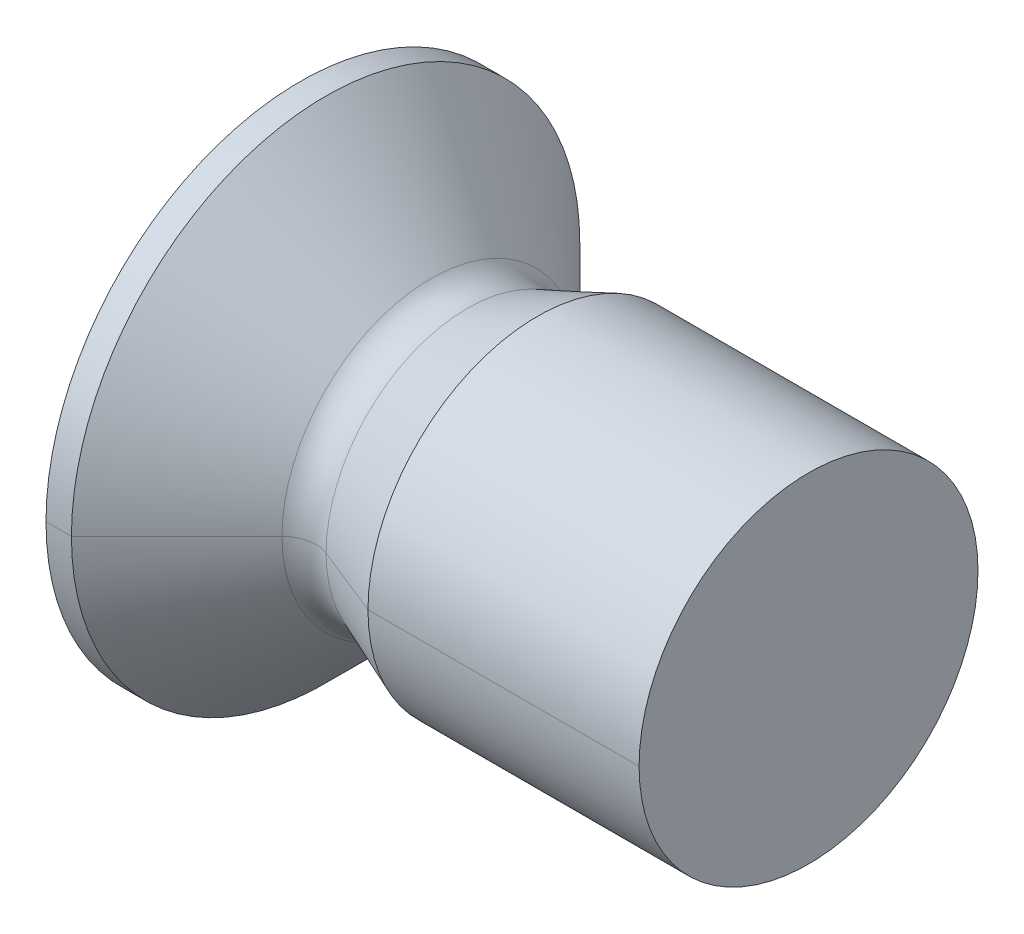
ISO-10303-21;
HEADER;
FILE_DESCRIPTION(('STEP AP214'),'2;1');
FILE_NAME('part.step','',(''),(''),'','','');
FILE_SCHEMA(('AUTOMOTIVE_DESIGN { 1 0 10303 214 1 1 1 1 }'));
ENDSEC;
DATA;
#1=APPLICATION_CONTEXT('core data for automotive mechanical design processes');
#2=APPLICATION_PROTOCOL_DEFINITION('international standard','automotive_design',2000,#1);
#3=PRODUCT_CONTEXT('',#1,'mechanical');
#4=PRODUCT('Part','Part','',(#3));
#5=PRODUCT_RELATED_PRODUCT_CATEGORY('part','',(#4));
#6=PRODUCT_DEFINITION_FORMATION('','',#4);
#7=PRODUCT_DEFINITION_CONTEXT('part definition',#1,'design');
#8=PRODUCT_DEFINITION('design','',#6,#7);
#9=PRODUCT_DEFINITION_SHAPE('','',#8);
#10=(LENGTH_UNIT() NAMED_UNIT(*) SI_UNIT(.MILLI.,.METRE.));
#11=(NAMED_UNIT(*) PLANE_ANGLE_UNIT() SI_UNIT($,.RADIAN.));
#12=(NAMED_UNIT(*) SI_UNIT($,.STERADIAN.) SOLID_ANGLE_UNIT());
#13=UNCERTAINTY_MEASURE_WITH_UNIT(LENGTH_MEASURE(1.E-05),#10,'distance_accuracy_value','');
#14=(GEOMETRIC_REPRESENTATION_CONTEXT(3) GLOBAL_UNCERTAINTY_ASSIGNED_CONTEXT((#13)) GLOBAL_UNIT_ASSIGNED_CONTEXT((#10,
#11,#12)) REPRESENTATION_CONTEXT('',''));
#15=CARTESIAN_POINT('',(0.,0.,0.));
#16=DIRECTION('',(0.,0.,1.));
#17=DIRECTION('',(1.,0.,0.));
#18=AXIS2_PLACEMENT_3D('',#15,#16,#17);
#19=CARTESIAN_POINT('',(-1.4,0.,0.));
#20=DIRECTION('',(1.,0.,0.));
#21=DIRECTION('',(0.,0.,-1.));
#22=AXIS2_PLACEMENT_3D('',#19,#20,#21);
#23=PLANE('',#22);
#24=CARTESIAN_POINT('',(-1.4,0.,0.));
#25=DIRECTION('',(1.,0.,0.));
#26=DIRECTION('',(0.,0.,-1.));
#27=AXIS2_PLACEMENT_3D('',#24,#25,#26);
#28=CIRCLE('',#27,3.);
#29=CARTESIAN_POINT('',(-1.4,0.,-3.));
#30=VERTEX_POINT('',#29);
#31=CARTESIAN_POINT('',(-1.4,0.,3.));
#32=VERTEX_POINT('',#31);
#33=EDGE_CURVE('E11',#30,#32,#28,.T.);
#34=ORIENTED_EDGE('',*,*,#33,.F.);
#35=CARTESIAN_POINT('',(-1.4,0.,0.));
#36=DIRECTION('',(1.,0.,0.));
#37=DIRECTION('',(0.,0.,-1.));
#38=AXIS2_PLACEMENT_3D('',#35,#36,#37);
#39=CIRCLE('',#38,3.);
#40=EDGE_CURVE('E25',#32,#30,#39,.T.);
#41=ORIENTED_EDGE('',*,*,#40,.F.);
#42=EDGE_LOOP('',(#34,#41));
#43=FACE_BOUND('',#42,.T.);
#44=DIRECTION('',(0.,0.,-1.));
#45=VECTOR('',#44,1.);
#46=CARTESIAN_POINT('',(-1.4,-0.4,2.25));
#47=LINE('',#46,#45);
#48=CARTESIAN_POINT('',(-1.4,-0.4,2.25));
#49=VERTEX_POINT('',#48);
#50=CARTESIAN_POINT('',(-1.4,-0.4,1.));
#51=VERTEX_POINT('',#50);
#52=EDGE_CURVE('E523',#49,#51,#47,.T.);
#53=ORIENTED_EDGE('',*,*,#52,.T.);
#54=CARTESIAN_POINT('',(-1.4,-0.999999999999995,0.999999999999995));
#55=DIRECTION('',(1.,0.,0.));
#56=DIRECTION('',(0.,0.,-1.));
#57=AXIS2_PLACEMENT_3D('',#54,#55,#56);
#58=CIRCLE('',#57,0.6);
#59=CARTESIAN_POINT('',(-1.4,-1.,0.4));
#60=VERTEX_POINT('',#59);
#61=EDGE_CURVE('E518',#60,#51,#58,.T.);
#62=ORIENTED_EDGE('',*,*,#61,.F.);
#63=DIRECTION('',(0.,-1.,0.));
#64=VECTOR('',#63,1.);
#65=CARTESIAN_POINT('',(-1.4,-1.,0.4));
#66=LINE('',#65,#64);
#67=CARTESIAN_POINT('',(-1.4,-2.25,0.4));
#68=VERTEX_POINT('',#67);
#69=EDGE_CURVE('E514',#60,#68,#66,.T.);
#70=ORIENTED_EDGE('',*,*,#69,.T.);
#71=DIRECTION('',(0.,0.,-1.));
#72=VECTOR('',#71,1.);
#73=CARTESIAN_POINT('',(-1.4,-2.25,0.4));
#74=LINE('',#73,#72);
#75=CARTESIAN_POINT('',(-1.4,-2.25,-0.4));
#76=VERTEX_POINT('',#75);
#77=EDGE_CURVE('E510',#68,#76,#74,.T.);
#78=ORIENTED_EDGE('',*,*,#77,.T.);
#79=DIRECTION('',(0.,1.,0.));
#80=VECTOR('',#79,1.);
#81=CARTESIAN_POINT('',(-1.4,-2.25,-0.4));
#82=LINE('',#81,#80);
#83=CARTESIAN_POINT('',(-1.4,-1.,-0.4));
#84=VERTEX_POINT('',#83);
#85=EDGE_CURVE('E506',#76,#84,#82,.T.);
#86=ORIENTED_EDGE('',*,*,#85,.T.);
#87=CARTESIAN_POINT('',(-1.4,-0.999999999999995,-0.999999999999995));
#88=DIRECTION('',(1.,0.,0.));
#89=DIRECTION('',(0.,0.,-1.));
#90=AXIS2_PLACEMENT_3D('',#87,#88,#89);
#91=CIRCLE('',#90,0.6);
#92=CARTESIAN_POINT('',(-1.4,-0.4,-1.));
#93=VERTEX_POINT('',#92);
#94=EDGE_CURVE('E501',#93,#84,#91,.T.);
#95=ORIENTED_EDGE('',*,*,#94,.F.);
#96=DIRECTION('',(0.,0.,-1.));
#97=VECTOR('',#96,1.);
#98=CARTESIAN_POINT('',(-1.4,-0.4,-1.));
#99=LINE('',#98,#97);
#100=CARTESIAN_POINT('',(-1.4,-0.4,-2.25));
#101=VERTEX_POINT('',#100);
#102=EDGE_CURVE('E497',#93,#101,#99,.T.);
#103=ORIENTED_EDGE('',*,*,#102,.T.);
#104=DIRECTION('',(0.,1.,0.));
#105=VECTOR('',#104,1.);
#106=CARTESIAN_POINT('',(-1.4,-0.4,-2.25));
#107=LINE('',#106,#105);
#108=CARTESIAN_POINT('',(-1.4,0.4,-2.25));
#109=VERTEX_POINT('',#108);
#110=EDGE_CURVE('E493',#101,#109,#107,.T.);
#111=ORIENTED_EDGE('',*,*,#110,.T.);
#112=DIRECTION('',(0.,0.,1.));
#113=VECTOR('',#112,1.);
#114=CARTESIAN_POINT('',(-1.4,0.4,-2.25));
#115=LINE('',#114,#113);
#116=CARTESIAN_POINT('',(-1.4,0.4,-1.));
#117=VERTEX_POINT('',#116);
#118=EDGE_CURVE('E489',#109,#117,#115,.T.);
#119=ORIENTED_EDGE('',*,*,#118,.T.);
#120=CARTESIAN_POINT('',(-1.4,0.999999999999995,-0.999999999999995));
#121=DIRECTION('',(1.,0.,0.));
#122=DIRECTION('',(0.,0.,-1.));
#123=AXIS2_PLACEMENT_3D('',#120,#121,#122);
#124=CIRCLE('',#123,0.6);
#125=CARTESIAN_POINT('',(-1.4,1.,-0.4));
#126=VERTEX_POINT('',#125);
#127=EDGE_CURVE('E484',#126,#117,#124,.T.);
#128=ORIENTED_EDGE('',*,*,#127,.F.);
#129=DIRECTION('',(0.,1.,0.));
#130=VECTOR('',#129,1.);
#131=CARTESIAN_POINT('',(-1.4,1.,-0.4));
#132=LINE('',#131,#130);
#133=CARTESIAN_POINT('',(-1.4,2.25,-0.4));
#134=VERTEX_POINT('',#133);
#135=EDGE_CURVE('E480',#126,#134,#132,.T.);
#136=ORIENTED_EDGE('',*,*,#135,.T.);
#137=DIRECTION('',(0.,0.,-1.));
#138=VECTOR('',#137,1.);
#139=CARTESIAN_POINT('',(-1.4,2.25,0.));
#140=LINE('',#139,#138);
#141=CARTESIAN_POINT('',(-1.4,2.25,0.4));
#142=VERTEX_POINT('',#141);
#143=EDGE_CURVE('E475',#142,#134,#140,.T.);
#144=ORIENTED_EDGE('',*,*,#143,.F.);
#145=DIRECTION('',(0.,-1.,0.));
#146=VECTOR('',#145,1.);
#147=CARTESIAN_POINT('',(-1.4,2.25,0.4));
#148=LINE('',#147,#146);
#149=CARTESIAN_POINT('',(-1.4,1.,0.4));
#150=VERTEX_POINT('',#149);
#151=EDGE_CURVE('E471',#142,#150,#148,.T.);
#152=ORIENTED_EDGE('',*,*,#151,.T.);
#153=CARTESIAN_POINT('',(-1.4,0.999999999999995,0.999999999999995));
#154=DIRECTION('',(1.,0.,0.));
#155=DIRECTION('',(0.,0.,-1.));
#156=AXIS2_PLACEMENT_3D('',#153,#154,#155);
#157=CIRCLE('',#156,0.6);
#158=CARTESIAN_POINT('',(-1.4,0.4,1.));
#159=VERTEX_POINT('',#158);
#160=EDGE_CURVE('E466',#159,#150,#157,.T.);
#161=ORIENTED_EDGE('',*,*,#160,.F.);
#162=DIRECTION('',(0.,0.,1.));
#163=VECTOR('',#162,1.);
#164=CARTESIAN_POINT('',(-1.4,0.4,1.));
#165=LINE('',#164,#163);
#166=CARTESIAN_POINT('',(-1.4,0.4,2.25));
#167=VERTEX_POINT('',#166);
#168=EDGE_CURVE('E462',#159,#167,#165,.T.);
#169=ORIENTED_EDGE('',*,*,#168,.T.);
#170=DIRECTION('',(0.,-1.,0.));
#171=VECTOR('',#170,1.);
#172=CARTESIAN_POINT('',(-1.4,0.4,2.25));
#173=LINE('',#172,#171);
#174=EDGE_CURVE('E458',#167,#49,#173,.T.);
#175=ORIENTED_EDGE('',*,*,#174,.T.);
#176=EDGE_LOOP('',(#53,#62,#70,#78,#86,#95,#103,#111,#119,#128,#136,#144,#152,#161,#169,#175));
#177=FACE_BOUND('',#176,.T.);
#178=ADVANCED_FACE('F17',(#43,#177),#23,.F.);
#179=CARTESIAN_POINT('',(-0.7,0.4,2.25));
#180=DIRECTION('',(0.,0.,-1.));
#181=DIRECTION('',(-1.,0.,0.));
#182=AXIS2_PLACEMENT_3D('',#179,#180,#181);
#183=PLANE('',#182);
#184=ORIENTED_EDGE('',*,*,#174,.F.);
#185=DIRECTION('',(-1.,0.,0.));
#186=VECTOR('',#185,1.);
#187=CARTESIAN_POINT('',(-0.7,0.4,2.25));
#188=LINE('',#187,#186);
#189=CARTESIAN_POINT('',(-0.7,0.4,2.25));
#190=VERTEX_POINT('',#189);
#191=EDGE_CURVE('E453',#190,#167,#188,.T.);
#192=ORIENTED_EDGE('',*,*,#191,.F.);
#193=DIRECTION('',(0.,-1.,0.));
#194=VECTOR('',#193,1.);
#195=CARTESIAN_POINT('',(-0.7,0.4,2.25));
#196=LINE('',#195,#194);
#197=CARTESIAN_POINT('',(-0.7,-0.4,2.25));
#198=VERTEX_POINT('',#197);
#199=EDGE_CURVE('E449',#190,#198,#196,.T.);
#200=ORIENTED_EDGE('',*,*,#199,.T.);
#201=DIRECTION('',(-1.,0.,0.));
#202=VECTOR('',#201,1.);
#203=CARTESIAN_POINT('',(-0.7,-0.4,2.25));
#204=LINE('',#203,#202);
#205=EDGE_CURVE('E444',#198,#49,#204,.T.);
#206=ORIENTED_EDGE('',*,*,#205,.T.);
#207=EDGE_LOOP('',(#184,#192,#200,#206));
#208=FACE_BOUND('',#207,.T.);
#209=ADVANCED_FACE('F557',(#208),#183,.T.);
#210=CARTESIAN_POINT('',(-0.7,-0.4,2.25));
#211=DIRECTION('',(0.,1.,0.));
#212=DIRECTION('',(0.,0.,1.));
#213=AXIS2_PLACEMENT_3D('',#210,#211,#212);
#214=PLANE('',#213);
#215=ORIENTED_EDGE('',*,*,#52,.F.);
#216=ORIENTED_EDGE('',*,*,#205,.F.);
#217=DIRECTION('',(0.,0.,-1.));
#218=VECTOR('',#217,1.);
#219=CARTESIAN_POINT('',(-0.7,-0.4,2.25));
#220=LINE('',#219,#218);
#221=CARTESIAN_POINT('',(-0.7,-0.4,1.));
#222=VERTEX_POINT('',#221);
#223=EDGE_CURVE('E440',#198,#222,#220,.T.);
#224=ORIENTED_EDGE('',*,*,#223,.T.);
#225=DIRECTION('',(-1.,0.,0.));
#226=VECTOR('',#225,1.);
#227=CARTESIAN_POINT('',(-0.7,-0.4,1.));
#228=LINE('',#227,#226);
#229=EDGE_CURVE('E435',#222,#51,#228,.T.);
#230=ORIENTED_EDGE('',*,*,#229,.T.);
#231=EDGE_LOOP('',(#215,#216,#224,#230));
#232=FACE_BOUND('',#231,.T.);
#233=ADVANCED_FACE('F561',(#232),#214,.T.);
#234=CARTESIAN_POINT('',(-0.7,-0.999999999999995,0.999999999999995));
#235=DIRECTION('',(1.,0.,0.));
#236=DIRECTION('',(0.,-0.707106781186548,0.707106781186547));
#237=AXIS2_PLACEMENT_3D('',#234,#235,#236);
#238=CYLINDRICAL_SURFACE('',#237,0.6);
#239=ORIENTED_EDGE('',*,*,#61,.T.);
#240=ORIENTED_EDGE('',*,*,#229,.F.);
#241=CARTESIAN_POINT('',(-0.7,-0.999999999999995,0.999999999999995));
#242=DIRECTION('',(1.,0.,0.));
#243=DIRECTION('',(0.,0.,-1.));
#244=AXIS2_PLACEMENT_3D('',#241,#242,#243);
#245=CIRCLE('',#244,0.6);
#246=CARTESIAN_POINT('',(-0.7,-1.,0.4));
#247=VERTEX_POINT('',#246);
#248=EDGE_CURVE('E430',#247,#222,#245,.T.);
#249=ORIENTED_EDGE('',*,*,#248,.F.);
#250=DIRECTION('',(-1.,0.,0.));
#251=VECTOR('',#250,1.);
#252=CARTESIAN_POINT('',(-0.7,-1.,0.4));
#253=LINE('',#252,#251);
#254=EDGE_CURVE('E425',#247,#60,#253,.T.);
#255=ORIENTED_EDGE('',*,*,#254,.T.);
#256=EDGE_LOOP('',(#239,#240,#249,#255));
#257=FACE_BOUND('',#256,.T.);
#258=ADVANCED_FACE('F571',(#257),#238,.T.);
#259=CARTESIAN_POINT('',(-0.7,-1.,0.4));
#260=DIRECTION('',(0.,0.,-1.));
#261=DIRECTION('',(-1.,0.,0.));
#262=AXIS2_PLACEMENT_3D('',#259,#260,#261);
#263=PLANE('',#262);
#264=ORIENTED_EDGE('',*,*,#69,.F.);
#265=ORIENTED_EDGE('',*,*,#254,.F.);
#266=DIRECTION('',(0.,-1.,0.));
#267=VECTOR('',#266,1.);
#268=CARTESIAN_POINT('',(-0.7,-1.,0.4));
#269=LINE('',#268,#267);
#270=CARTESIAN_POINT('',(-0.7,-2.25,0.4));
#271=VERTEX_POINT('',#270);
#272=EDGE_CURVE('E421',#247,#271,#269,.T.);
#273=ORIENTED_EDGE('',*,*,#272,.T.);
#274=DIRECTION('',(-1.,0.,0.));
#275=VECTOR('',#274,1.);
#276=CARTESIAN_POINT('',(-0.7,-2.25,0.4));
#277=LINE('',#276,#275);
#278=EDGE_CURVE('E416',#271,#68,#277,.T.);
#279=ORIENTED_EDGE('',*,*,#278,.T.);
#280=EDGE_LOOP('',(#264,#265,#273,#279));
#281=FACE_BOUND('',#280,.T.);
#282=ADVANCED_FACE('F576',(#281),#263,.T.);
#283=CARTESIAN_POINT('',(-0.7,-2.25,0.4));
#284=DIRECTION('',(0.,1.,0.));
#285=DIRECTION('',(0.,0.,1.));
#286=AXIS2_PLACEMENT_3D('',#283,#284,#285);
#287=PLANE('',#286);
#288=ORIENTED_EDGE('',*,*,#77,.F.);
#289=ORIENTED_EDGE('',*,*,#278,.F.);
#290=DIRECTION('',(0.,0.,-1.));
#291=VECTOR('',#290,1.);
#292=CARTESIAN_POINT('',(-0.7,-2.25,0.4));
#293=LINE('',#292,#291);
#294=CARTESIAN_POINT('',(-0.7,-2.25,-0.4));
#295=VERTEX_POINT('',#294);
#296=EDGE_CURVE('E412',#271,#295,#293,.T.);
#297=ORIENTED_EDGE('',*,*,#296,.T.);
#298=DIRECTION('',(-1.,0.,0.));
#299=VECTOR('',#298,1.);
#300=CARTESIAN_POINT('',(-0.7,-2.25,-0.4));
#301=LINE('',#300,#299);
#302=EDGE_CURVE('E407',#295,#76,#301,.T.);
#303=ORIENTED_EDGE('',*,*,#302,.T.);
#304=EDGE_LOOP('',(#288,#289,#297,#303));
#305=FACE_BOUND('',#304,.T.);
#306=ADVANCED_FACE('F582',(#305),#287,.T.);
#307=CARTESIAN_POINT('',(-0.7,-2.25,-0.4));
#308=DIRECTION('',(0.,0.,1.));
#309=DIRECTION('',(1.,0.,0.));
#310=AXIS2_PLACEMENT_3D('',#307,#308,#309);
#311=PLANE('',#310);
#312=ORIENTED_EDGE('',*,*,#85,.F.);
#313=ORIENTED_EDGE('',*,*,#302,.F.);
#314=DIRECTION('',(0.,1.,0.));
#315=VECTOR('',#314,1.);
#316=CARTESIAN_POINT('',(-0.7,-2.25,-0.4));
#317=LINE('',#316,#315);
#318=CARTESIAN_POINT('',(-0.7,-1.,-0.4));
#319=VERTEX_POINT('',#318);
#320=EDGE_CURVE('E403',#295,#319,#317,.T.);
#321=ORIENTED_EDGE('',*,*,#320,.T.);
#322=DIRECTION('',(-1.,0.,0.));
#323=VECTOR('',#322,1.);
#324=CARTESIAN_POINT('',(-0.7,-1.,-0.4));
#325=LINE('',#324,#323);
#326=EDGE_CURVE('E398',#319,#84,#325,.T.);
#327=ORIENTED_EDGE('',*,*,#326,.T.);
#328=EDGE_LOOP('',(#312,#313,#321,#327));
#329=FACE_BOUND('',#328,.T.);
#330=ADVANCED_FACE('F586',(#329),#311,.T.);
#331=CARTESIAN_POINT('',(-0.7,-0.999999999999995,-0.999999999999995));
#332=DIRECTION('',(1.,0.,0.));
#333=DIRECTION('',(0.,-0.707106781186548,-0.707106781186547));
#334=AXIS2_PLACEMENT_3D('',#331,#332,#333);
#335=CYLINDRICAL_SURFACE('',#334,0.6);
#336=ORIENTED_EDGE('',*,*,#94,.T.);
#337=ORIENTED_EDGE('',*,*,#326,.F.);
#338=CARTESIAN_POINT('',(-0.7,-0.999999999999995,-0.999999999999995));
#339=DIRECTION('',(1.,0.,0.));
#340=DIRECTION('',(0.,0.,-1.));
#341=AXIS2_PLACEMENT_3D('',#338,#339,#340);
#342=CIRCLE('',#341,0.6);
#343=CARTESIAN_POINT('',(-0.7,-0.4,-1.));
#344=VERTEX_POINT('',#343);
#345=EDGE_CURVE('E393',#344,#319,#342,.T.);
#346=ORIENTED_EDGE('',*,*,#345,.F.);
#347=DIRECTION('',(-1.,0.,0.));
#348=VECTOR('',#347,1.);
#349=CARTESIAN_POINT('',(-0.7,-0.4,-1.));
#350=LINE('',#349,#348);
#351=EDGE_CURVE('E388',#344,#93,#350,.T.);
#352=ORIENTED_EDGE('',*,*,#351,.T.);
#353=EDGE_LOOP('',(#336,#337,#346,#352));
#354=FACE_BOUND('',#353,.T.);
#355=ADVANCED_FACE('F589',(#354),#335,.T.);
#356=CARTESIAN_POINT('',(-0.7,-0.4,-1.));
#357=DIRECTION('',(0.,1.,0.));
#358=DIRECTION('',(0.,0.,1.));
#359=AXIS2_PLACEMENT_3D('',#356,#357,#358);
#360=PLANE('',#359);
#361=ORIENTED_EDGE('',*,*,#102,.F.);
#362=ORIENTED_EDGE('',*,*,#351,.F.);
#363=DIRECTION('',(0.,0.,-1.));
#364=VECTOR('',#363,1.);
#365=CARTESIAN_POINT('',(-0.7,-0.4,-1.));
#366=LINE('',#365,#364);
#367=CARTESIAN_POINT('',(-0.7,-0.4,-2.25));
#368=VERTEX_POINT('',#367);
#369=EDGE_CURVE('E384',#344,#368,#366,.T.);
#370=ORIENTED_EDGE('',*,*,#369,.T.);
#371=DIRECTION('',(-1.,0.,0.));
#372=VECTOR('',#371,1.);
#373=CARTESIAN_POINT('',(-0.7,-0.4,-2.25));
#374=LINE('',#373,#372);
#375=EDGE_CURVE('E379',#368,#101,#374,.T.);
#376=ORIENTED_EDGE('',*,*,#375,.T.);
#377=EDGE_LOOP('',(#361,#362,#370,#376));
#378=FACE_BOUND('',#377,.T.);
#379=ADVANCED_FACE('F595',(#378),#360,.T.);
#380=CARTESIAN_POINT('',(-0.7,-0.4,-2.25));
#381=DIRECTION('',(0.,0.,1.));
#382=DIRECTION('',(1.,0.,0.));
#383=AXIS2_PLACEMENT_3D('',#380,#381,#382);
#384=PLANE('',#383);
#385=ORIENTED_EDGE('',*,*,#110,.F.);
#386=ORIENTED_EDGE('',*,*,#375,.F.);
#387=DIRECTION('',(0.,1.,0.));
#388=VECTOR('',#387,1.);
#389=CARTESIAN_POINT('',(-0.7,-0.4,-2.25));
#390=LINE('',#389,#388);
#391=CARTESIAN_POINT('',(-0.7,0.4,-2.25));
#392=VERTEX_POINT('',#391);
#393=EDGE_CURVE('E375',#368,#392,#390,.T.);
#394=ORIENTED_EDGE('',*,*,#393,.T.);
#395=DIRECTION('',(-1.,0.,0.));
#396=VECTOR('',#395,1.);
#397=CARTESIAN_POINT('',(-0.7,0.4,-2.25));
#398=LINE('',#397,#396);
#399=EDGE_CURVE('E370',#392,#109,#398,.T.);
#400=ORIENTED_EDGE('',*,*,#399,.T.);
#401=EDGE_LOOP('',(#385,#386,#394,#400));
#402=FACE_BOUND('',#401,.T.);
#403=ADVANCED_FACE('F599',(#402),#384,.T.);
#404=CARTESIAN_POINT('',(-0.7,0.4,-2.25));
#405=DIRECTION('',(0.,-1.,0.));
#406=DIRECTION('',(0.,0.,-1.));
#407=AXIS2_PLACEMENT_3D('',#404,#405,#406);
#408=PLANE('',#407);
#409=ORIENTED_EDGE('',*,*,#118,.F.);
#410=ORIENTED_EDGE('',*,*,#399,.F.);
#411=DIRECTION('',(0.,0.,1.));
#412=VECTOR('',#411,1.);
#413=CARTESIAN_POINT('',(-0.7,0.4,-2.25));
#414=LINE('',#413,#412);
#415=CARTESIAN_POINT('',(-0.7,0.4,-1.));
#416=VERTEX_POINT('',#415);
#417=EDGE_CURVE('E366',#392,#416,#414,.T.);
#418=ORIENTED_EDGE('',*,*,#417,.T.);
#419=DIRECTION('',(-1.,0.,0.));
#420=VECTOR('',#419,1.);
#421=CARTESIAN_POINT('',(-0.7,0.4,-1.));
#422=LINE('',#421,#420);
#423=EDGE_CURVE('E361',#416,#117,#422,.T.);
#424=ORIENTED_EDGE('',*,*,#423,.T.);
#425=EDGE_LOOP('',(#409,#410,#418,#424));
#426=FACE_BOUND('',#425,.T.);
#427=ADVANCED_FACE('F604',(#426),#408,.T.);
#428=CARTESIAN_POINT('',(-0.7,0.999999999999995,-0.999999999999995));
#429=DIRECTION('',(1.,0.,0.));
#430=DIRECTION('',(0.,0.707106781186553,-0.707106781186542));
#431=AXIS2_PLACEMENT_3D('',#428,#429,#430);
#432=CYLINDRICAL_SURFACE('',#431,0.6);
#433=ORIENTED_EDGE('',*,*,#127,.T.);
#434=ORIENTED_EDGE('',*,*,#423,.F.);
#435=CARTESIAN_POINT('',(-0.7,0.999999999999995,-0.999999999999995));
#436=DIRECTION('',(1.,0.,0.));
#437=DIRECTION('',(0.,0.,-1.));
#438=AXIS2_PLACEMENT_3D('',#435,#436,#437);
#439=CIRCLE('',#438,0.6);
#440=CARTESIAN_POINT('',(-0.7,1.,-0.4));
#441=VERTEX_POINT('',#440);
#442=EDGE_CURVE('E356',#441,#416,#439,.T.);
#443=ORIENTED_EDGE('',*,*,#442,.F.);
#444=DIRECTION('',(-1.,0.,0.));
#445=VECTOR('',#444,1.);
#446=CARTESIAN_POINT('',(-0.7,1.,-0.4));
#447=LINE('',#446,#445);
#448=EDGE_CURVE('E351',#441,#126,#447,.T.);
#449=ORIENTED_EDGE('',*,*,#448,.T.);
#450=EDGE_LOOP('',(#433,#434,#443,#449));
#451=FACE_BOUND('',#450,.T.);
#452=ADVANCED_FACE('F609',(#451),#432,.T.);
#453=CARTESIAN_POINT('',(-0.7,1.,-0.4));
#454=DIRECTION('',(0.,0.,1.));
#455=DIRECTION('',(1.,0.,0.));
#456=AXIS2_PLACEMENT_3D('',#453,#454,#455);
#457=PLANE('',#456);
#458=ORIENTED_EDGE('',*,*,#135,.F.);
#459=ORIENTED_EDGE('',*,*,#448,.F.);
#460=DIRECTION('',(0.,1.,0.));
#461=VECTOR('',#460,1.);
#462=CARTESIAN_POINT('',(-0.7,1.,-0.4));
#463=LINE('',#462,#461);
#464=CARTESIAN_POINT('',(-0.7,2.25,-0.4));
#465=VERTEX_POINT('',#464);
#466=EDGE_CURVE('E347',#441,#465,#463,.T.);
#467=ORIENTED_EDGE('',*,*,#466,.T.);
#468=DIRECTION('',(-1.,0.,0.));
#469=VECTOR('',#468,1.);
#470=CARTESIAN_POINT('',(-0.7,2.25,-0.4));
#471=LINE('',#470,#469);
#472=EDGE_CURVE('E342',#465,#134,#471,.T.);
#473=ORIENTED_EDGE('',*,*,#472,.T.);
#474=EDGE_LOOP('',(#458,#459,#467,#473));
#475=FACE_BOUND('',#474,.T.);
#476=ADVANCED_FACE('F612',(#475),#457,.T.);
#477=CARTESIAN_POINT('',(-0.7,2.25,-0.4));
#478=DIRECTION('',(0.,-1.,0.));
#479=DIRECTION('',(0.,0.,-1.));
#480=AXIS2_PLACEMENT_3D('',#477,#478,#479);
#481=PLANE('',#480);
#482=ORIENTED_EDGE('',*,*,#143,.T.);
#483=ORIENTED_EDGE('',*,*,#472,.F.);
#484=DIRECTION('',(0.,0.,1.));
#485=VECTOR('',#484,1.);
#486=CARTESIAN_POINT('',(-0.7,2.25,-0.4));
#487=LINE('',#486,#485);
#488=CARTESIAN_POINT('',(-0.7,2.25,0.4));
#489=VERTEX_POINT('',#488);
#490=EDGE_CURVE('E338',#465,#489,#487,.T.);
#491=ORIENTED_EDGE('',*,*,#490,.T.);
#492=DIRECTION('',(-1.,0.,0.));
#493=VECTOR('',#492,1.);
#494=CARTESIAN_POINT('',(-0.7,2.25,0.4));
#495=LINE('',#494,#493);
#496=EDGE_CURVE('E333',#489,#142,#495,.T.);
#497=ORIENTED_EDGE('',*,*,#496,.T.);
#498=EDGE_LOOP('',(#482,#483,#491,#497));
#499=FACE_BOUND('',#498,.T.);
#500=ADVANCED_FACE('F616',(#499),#481,.T.);
#501=CARTESIAN_POINT('',(-0.7,2.25,0.4));
#502=DIRECTION('',(0.,0.,-1.));
#503=DIRECTION('',(-1.,0.,0.));
#504=AXIS2_PLACEMENT_3D('',#501,#502,#503);
#505=PLANE('',#504);
#506=ORIENTED_EDGE('',*,*,#151,.F.);
#507=ORIENTED_EDGE('',*,*,#496,.F.);
#508=DIRECTION('',(0.,-1.,0.));
#509=VECTOR('',#508,1.);
#510=CARTESIAN_POINT('',(-0.7,2.25,0.4));
#511=LINE('',#510,#509);
#512=CARTESIAN_POINT('',(-0.7,1.,0.4));
#513=VERTEX_POINT('',#512);
#514=EDGE_CURVE('E329',#489,#513,#511,.T.);
#515=ORIENTED_EDGE('',*,*,#514,.T.);
#516=DIRECTION('',(-1.,0.,0.));
#517=VECTOR('',#516,1.);
#518=CARTESIAN_POINT('',(-0.7,1.,0.4));
#519=LINE('',#518,#517);
#520=EDGE_CURVE('E324',#513,#150,#519,.T.);
#521=ORIENTED_EDGE('',*,*,#520,.T.);
#522=EDGE_LOOP('',(#506,#507,#515,#521));
#523=FACE_BOUND('',#522,.T.);
#524=ADVANCED_FACE('F621',(#523),#505,.T.);
#525=CARTESIAN_POINT('',(-0.7,0.999999999999995,0.999999999999995));
#526=DIRECTION('',(1.,0.,0.));
#527=DIRECTION('',(0.,0.707106781186548,0.707106781186547));
#528=AXIS2_PLACEMENT_3D('',#525,#526,#527);
#529=CYLINDRICAL_SURFACE('',#528,0.6);
#530=ORIENTED_EDGE('',*,*,#160,.T.);
#531=ORIENTED_EDGE('',*,*,#520,.F.);
#532=CARTESIAN_POINT('',(-0.7,0.999999999999995,0.999999999999995));
#533=DIRECTION('',(1.,0.,0.));
#534=DIRECTION('',(0.,0.,-1.));
#535=AXIS2_PLACEMENT_3D('',#532,#533,#534);
#536=CIRCLE('',#535,0.6);
#537=CARTESIAN_POINT('',(-0.7,0.4,1.));
#538=VERTEX_POINT('',#537);
#539=EDGE_CURVE('E319',#538,#513,#536,.T.);
#540=ORIENTED_EDGE('',*,*,#539,.F.);
#541=DIRECTION('',(-1.,0.,0.));
#542=VECTOR('',#541,1.);
#543=CARTESIAN_POINT('',(-0.7,0.4,1.));
#544=LINE('',#543,#542);
#545=EDGE_CURVE('E314',#538,#159,#544,.T.);
#546=ORIENTED_EDGE('',*,*,#545,.T.);
#547=EDGE_LOOP('',(#530,#531,#540,#546));
#548=FACE_BOUND('',#547,.T.);
#549=ADVANCED_FACE('F624',(#548),#529,.T.);
#550=CARTESIAN_POINT('',(-0.7,0.4,1.));
#551=DIRECTION('',(0.,-1.,0.));
#552=DIRECTION('',(0.,0.,-1.));
#553=AXIS2_PLACEMENT_3D('',#550,#551,#552);
#554=PLANE('',#553);
#555=ORIENTED_EDGE('',*,*,#168,.F.);
#556=ORIENTED_EDGE('',*,*,#545,.F.);
#557=DIRECTION('',(0.,0.,1.));
#558=VECTOR('',#557,1.);
#559=CARTESIAN_POINT('',(-0.7,0.4,1.));
#560=LINE('',#559,#558);
#561=EDGE_CURVE('E309',#538,#190,#560,.T.);
#562=ORIENTED_EDGE('',*,*,#561,.T.);
#563=ORIENTED_EDGE('',*,*,#191,.T.);
#564=EDGE_LOOP('',(#555,#556,#562,#563));
#565=FACE_BOUND('',#564,.T.);
#566=ADVANCED_FACE('F629',(#565),#554,.T.);
#567=CARTESIAN_POINT('',(-0.7,-0.999999999999995,0.999999999999995));
#568=DIRECTION('',(1.,0.,0.));
#569=DIRECTION('',(0.,0.,-1.));
#570=AXIS2_PLACEMENT_3D('',#567,#568,#569);
#571=PLANE('',#570);
#572=ORIENTED_EDGE('',*,*,#199,.F.);
#573=ORIENTED_EDGE('',*,*,#561,.F.);
#574=ORIENTED_EDGE('',*,*,#539,.T.);
#575=ORIENTED_EDGE('',*,*,#514,.F.);
#576=ORIENTED_EDGE('',*,*,#490,.F.);
#577=ORIENTED_EDGE('',*,*,#466,.F.);
#578=ORIENTED_EDGE('',*,*,#442,.T.);
#579=ORIENTED_EDGE('',*,*,#417,.F.);
#580=ORIENTED_EDGE('',*,*,#393,.F.);
#581=ORIENTED_EDGE('',*,*,#369,.F.);
#582=ORIENTED_EDGE('',*,*,#345,.T.);
#583=ORIENTED_EDGE('',*,*,#320,.F.);
#584=ORIENTED_EDGE('',*,*,#296,.F.);
#585=ORIENTED_EDGE('',*,*,#272,.F.);
#586=ORIENTED_EDGE('',*,*,#248,.T.);
#587=ORIENTED_EDGE('',*,*,#223,.F.);
#588=EDGE_LOOP('',(#572,#573,#574,#575,#576,#577,#578,#579,#580,#581,#582,#583,#584,#585,#586,#587));
#589=FACE_BOUND('',#588,.T.);
#590=ADVANCED_FACE('F632',(#589),#571,.F.);
#591=CARTESIAN_POINT('',(4.6,0.,0.));
#592=DIRECTION('',(-1.,0.,0.));
#593=DIRECTION('',(0.,1.,0.));
#594=AXIS2_PLACEMENT_3D('',#591,#592,#593);
#595=CYLINDRICAL_SURFACE('',#594,3.);
#596=ORIENTED_EDGE('',*,*,#40,.T.);
#597=DIRECTION('',(-1.,0.,0.));
#598=VECTOR('',#597,1.);
#599=CARTESIAN_POINT('',(-1.1,0.,-3.));
#600=LINE('',#599,#598);
#601=CARTESIAN_POINT('',(-1.1,0.,-3.));
#602=VERTEX_POINT('',#601);
#603=EDGE_CURVE('E304',#602,#30,#600,.T.);
#604=ORIENTED_EDGE('',*,*,#603,.F.);
#605=CARTESIAN_POINT('',(-1.1,0.,0.));
#606=DIRECTION('',(1.,0.,0.));
#607=DIRECTION('',(0.,0.,-1.));
#608=AXIS2_PLACEMENT_3D('',#605,#606,#607);
#609=CIRCLE('',#608,3.);
#610=CARTESIAN_POINT('',(-1.1,0.,3.));
#611=VERTEX_POINT('',#610);
#612=EDGE_CURVE('E299',#611,#602,#609,.T.);
#613=ORIENTED_EDGE('',*,*,#612,.F.);
#614=DIRECTION('',(-1.,0.,0.));
#615=VECTOR('',#614,1.);
#616=CARTESIAN_POINT('',(-1.1,0.,3.));
#617=LINE('',#616,#615);
#618=EDGE_CURVE('E295',#611,#32,#617,.T.);
#619=ORIENTED_EDGE('',*,*,#618,.T.);
#620=EDGE_LOOP('',(#596,#604,#613,#619));
#621=FACE_BOUND('',#620,.T.);
#622=ADVANCED_FACE('F532',(#621),#595,.T.);
#623=CARTESIAN_POINT('',(4.6,0.,0.));
#624=DIRECTION('',(-1.,0.,0.));
#625=DIRECTION('',(0.,-1.,0.));
#626=AXIS2_PLACEMENT_3D('',#623,#624,#625);
#627=CYLINDRICAL_SURFACE('',#626,3.);
#628=CARTESIAN_POINT('',(-1.1,0.,0.));
#629=DIRECTION('',(1.,0.,0.));
#630=DIRECTION('',(0.,0.,-1.));
#631=AXIS2_PLACEMENT_3D('',#628,#629,#630);
#632=CIRCLE('',#631,3.);
#633=EDGE_CURVE('E290',#602,#611,#632,.T.);
#634=ORIENTED_EDGE('',*,*,#633,.F.);
#635=ORIENTED_EDGE('',*,*,#603,.T.);
#636=ORIENTED_EDGE('',*,*,#33,.T.);
#637=ORIENTED_EDGE('',*,*,#618,.F.);
#638=EDGE_LOOP('',(#634,#635,#636,#637));
#639=FACE_BOUND('',#638,.T.);
#640=ADVANCED_FACE('F536',(#639),#627,.T.);
#641=CARTESIAN_POINT('',(-1.1,0.,0.));
#642=DIRECTION('',(-1.,0.,0.));
#643=DIRECTION('',(0.,-1.,0.));
#644=AXIS2_PLACEMENT_3D('',#641,#642,#643);
#645=CONICAL_SURFACE('',#644,3.,0.7853981634);
#646=CARTESIAN_POINT('',(0.142782192563589,0.,0.));
#647=DIRECTION('',(1.,0.,0.));
#648=DIRECTION('',(0.,0.,-1.));
#649=AXIS2_PLACEMENT_3D('',#646,#647,#648);
#650=CIRCLE('',#649,1.7572178074);
#651=CARTESIAN_POINT('',(0.142782192563589,0.,-1.7572178074364));
#652=VERTEX_POINT('',#651);
#653=CARTESIAN_POINT('',(0.142782192576267,0.,1.75721780741268));
#654=VERTEX_POINT('',#653);
#655=EDGE_CURVE('E286',#652,#654,#650,.T.);
#656=ORIENTED_EDGE('',*,*,#655,.F.);
#657=DIRECTION('',(-0.707106781184743,0.,-0.707106781188352));
#658=VECTOR('',#657,1.);
#659=CARTESIAN_POINT('',(0.142782192578623,0.,-1.75721780741503));
#660=LINE('',#659,#658);
#661=EDGE_CURVE('E281',#652,#602,#660,.T.);
#662=ORIENTED_EDGE('',*,*,#661,.T.);
#663=ORIENTED_EDGE('',*,*,#633,.T.);
#664=DIRECTION('',(-0.707106781184743,0.,0.707106781188352));
#665=VECTOR('',#664,1.);
#666=CARTESIAN_POINT('',(0.142782192578623,0.,1.75721780741503));
#667=LINE('',#666,#665);
#668=EDGE_CURVE('E276',#654,#611,#667,.T.);
#669=ORIENTED_EDGE('',*,*,#668,.F.);
#670=EDGE_LOOP('',(#656,#662,#663,#669));
#671=FACE_BOUND('',#670,.T.);
#672=ADVANCED_FACE('F539',(#671),#645,.T.);
#673=CARTESIAN_POINT('',(-1.1,0.,0.));
#674=DIRECTION('',(-1.,0.,0.));
#675=DIRECTION('',(0.,1.,0.));
#676=AXIS2_PLACEMENT_3D('',#673,#674,#675);
#677=CONICAL_SURFACE('',#676,3.,0.7853981634);
#678=ORIENTED_EDGE('',*,*,#612,.T.);
#679=ORIENTED_EDGE('',*,*,#661,.F.);
#680=CARTESIAN_POINT('',(0.142782192563589,0.,0.));
#681=DIRECTION('',(1.,0.,0.));
#682=DIRECTION('',(0.,0.,-1.));
#683=AXIS2_PLACEMENT_3D('',#680,#681,#682);
#684=CIRCLE('',#683,1.7572178074);
#685=EDGE_CURVE('E272',#654,#652,#684,.T.);
#686=ORIENTED_EDGE('',*,*,#685,.F.);
#687=ORIENTED_EDGE('',*,*,#668,.T.);
#688=EDGE_LOOP('',(#678,#679,#686,#687));
#689=FACE_BOUND('',#688,.T.);
#690=ADVANCED_FACE('F542',(#689),#677,.T.);
#691=CARTESIAN_POINT('',(0.425624905038184,0.,0.));
#692=DIRECTION('',(1.,0.,0.));
#693=DIRECTION('',(0.,1.,0.));
#694=AXIS2_PLACEMENT_3D('',#691,#692,#693);
#695=TOROIDAL_SURFACE('',#694,2.0400605199,0.4);
#696=CARTESIAN_POINT('',(0.57456973435672,0.,0.));
#697=DIRECTION('',(1.,0.,0.));
#698=DIRECTION('',(0.,0.,-1.));
#699=AXIS2_PLACEMENT_3D('',#696,#697,#698);
#700=CIRCLE('',#699,1.6688255029);
#701=CARTESIAN_POINT('',(0.57456973435672,0.,1.6688255029));
#702=VERTEX_POINT('',#701);
#703=CARTESIAN_POINT('',(0.57456973435672,0.,-1.6688255029484));
#704=VERTEX_POINT('',#703);
#705=EDGE_CURVE('E269',#702,#704,#700,.T.);
#706=ORIENTED_EDGE('',*,*,#705,.F.);
#707=CARTESIAN_POINT('',(0.574569734343819,0.,1.66882550293216));
#708=CARTESIAN_POINT('',(0.570057112574015,0.,1.66701492856982));
#709=CARTESIAN_POINT('',(0.565511449758645,0.,1.66528671398238));
#710=CARTESIAN_POINT('',(0.556360149349123,0.,1.66199712741318));
#711=CARTESIAN_POINT('',(0.551754511754971,0.,1.66043575543141));
#712=CARTESIAN_POINT('',(0.542489369100236,0.,1.65748197712942));
#713=CARTESIAN_POINT('',(0.537829864039654,0.,1.65608957080919));
#714=CARTESIAN_POINT('',(0.528463186761261,0.,1.65347556276552));
#715=CARTESIAN_POINT('',(0.52375601454345,0.,1.65225396104208));
#716=CARTESIAN_POINT('',(0.514300260917602,0.,1.64998318993486));
#717=CARTESIAN_POINT('',(0.509551679509564,0.,1.64893402055107));
#718=CARTESIAN_POINT('',(0.500019422066707,0.,1.64700950831291));
#719=CARTESIAN_POINT('',(0.495235746031888,0.,1.64613416545854));
#720=CARTESIAN_POINT('',(0.485639660153523,0.,1.64455847047359));
#721=CARTESIAN_POINT('',(0.480827250309977,0.,1.64385811834301));
#722=CARTESIAN_POINT('',(0.471180095950017,0.,1.64263333600657));
#723=CARTESIAN_POINT('',(0.466345351433604,0.,1.64210890580071));
#724=CARTESIAN_POINT('',(0.456659956532903,0.,1.64123666467149));
#725=CARTESIAN_POINT('',(0.451809306148615,0.,1.64088885374812));
#726=CARTESIAN_POINT('',(0.442098549475273,0.,1.64037031366713));
#727=CARTESIAN_POINT('',(0.437238443186218,0.,1.6401995845095));
#728=CARTESIAN_POINT('',(0.427515237237944,0.,1.64003543498159));
#729=CARTESIAN_POINT('',(0.422652137578724,0.,1.64004201461132));
#730=CARTESIAN_POINT('',(0.412929411405608,0.,1.64023247390878));
#731=CARTESIAN_POINT('',(0.408069784891712,0.,1.64041635357653));
#732=CARTESIAN_POINT('',(0.398360466906299,0.,1.64096116844337));
#733=CARTESIAN_POINT('',(0.393510775434782,0.,1.64132210364247));
#734=CARTESIAN_POINT('',(0.383827776220496,0.,1.64222054963263));
#735=CARTESIAN_POINT('',(0.378994468477725,0.,1.64275806042369));
#736=CARTESIAN_POINT('',(0.369350663621668,0.,1.64400894286395));
#737=CARTESIAN_POINT('',(0.36454016650838,0.,1.64472231451316));
#738=CARTESIAN_POINT('',(0.354948379480492,0.,1.64632397009183));
#739=CARTESIAN_POINT('',(0.35016708956589,0.,1.64721225402131));
#740=CARTESIAN_POINT('',(0.340640074667453,0.,1.64916255299994));
#741=CARTESIAN_POINT('',(0.335894349683617,0.,1.65022456804909));
#742=CARTESIAN_POINT('',(0.326444775087722,0.,1.65252091709436));
#743=CARTESIAN_POINT('',(0.321740925475663,0.,1.65375525109047));
#744=CARTESIAN_POINT('',(0.31238135638221,0.,1.65639459672263));
#745=CARTESIAN_POINT('',(0.307725636900815,0.,1.65779960835866));
#746=CARTESIAN_POINT('',(0.298468518828423,0.,1.66077844101171));
#747=CARTESIAN_POINT('',(0.293867120237426,0.,1.66235226202873));
#748=CARTESIAN_POINT('',(0.284724762474518,0.,1.66566662071723));
#749=CARTESIAN_POINT('',(0.280183803302607,0.,1.6674071583887));
#750=CARTESIAN_POINT('',(0.271168362539542,0.,1.67105263597457));
#751=CARTESIAN_POINT('',(0.266693880948387,0.,1.67295757588896));
#752=CARTESIAN_POINT('',(0.257817345112861,0.,1.67692932494204));
#753=CARTESIAN_POINT('',(0.25341529086849,0.,1.67899613408074));
#754=CARTESIAN_POINT('',(0.244689463184003,0.,1.68328887332336));
#755=CARTESIAN_POINT('',(0.240365689743888,0.,1.68551480342728));
#756=CARTESIAN_POINT('',(0.231802173038831,0.,1.69012282476102));
#757=CARTESIAN_POINT('',(0.22756242977389,0.,1.69250491599085));
#758=CARTESIAN_POINT('',(0.219172611038364,0.,1.69742209207083));
#759=CARTESIAN_POINT('',(0.21502253556778,0.,1.69995717692099));
#760=CARTESIAN_POINT('',(0.206817570867336,0.,1.70517696936275));
#761=CARTESIAN_POINT('',(0.202762681637476,0.,1.70786167695434));
#762=CARTESIAN_POINT('',(0.194753481072988,0.,1.71337714480663));
#763=CARTESIAN_POINT('',(0.19079916973836,0.,1.71620790506731));
#764=CARTESIAN_POINT('',(0.182996383706751,0.,1.7220117148677));
#765=CARTESIAN_POINT('',(0.179147909009771,0.,1.7249847644074));
#766=CARTESIAN_POINT('',(0.171561911175851,0.,1.73106919685042));
#767=CARTESIAN_POINT('',(0.167824388038911,0.,1.73418057975374));
#768=CARTESIAN_POINT('',(0.160465272238264,0.,1.74053755146223));
#769=CARTESIAN_POINT('',(0.156843679574556,0.,1.74378314026741));
#770=CARTESIAN_POINT('',(0.14972120647043,0.,1.75040417159663));
#771=CARTESIAN_POINT('',(0.146220326030012,0.,1.75377961412068));
#772=CARTESIAN_POINT('',(0.142782192576268,0.,1.75721780741268));
#773=B_SPLINE_CURVE_WITH_KNOTS('',3,(#707,#708,#709,#710,#711,#712,#713,#714,#715,#716,#717,
#718,#719,#720,#721,#722,#723,#724,#725,#726,#727,#728,#729,#730,#731,#732,#733,#734,#735,#736,
#737,#738,#739,#740,#741,#742,#743,#744,#745,#746,#747,#748,#749,#750,#751,#752,#753,#754,#755,
#756,#757,#758,#759,#760,#761,#762,#763,#764,#765,#766,#767,#768,#769,#770,#771,#772),
.UNSPECIFIED.,.F.,.F.,(4,2,2,2,2,2,2,2,2,2,2,2,2,2,2,2,2,2,2,2,2,2,2,2,2,2,2,2,2,2,2,2,4),(0.,
0.014586079070015,0.0291721581400302,0.0437582372100454,0.0583443162800603,0.0729303953500754,
0.0875164744200906,0.102102553490106,0.116688632560121,0.131274711630136,0.145860790700151,
0.160446869770166,0.175032948840182,0.189619027910196,0.204205106980212,0.218791186050227,
0.233377265120242,0.247963344190257,0.262549423260272,0.277135502330287,0.291721581400302,
0.306307660470318,0.320893739540332,0.335479818610348,0.350065897680363,0.364651976750378,
0.379238055820393,0.393824134890408,0.408410213960423,0.422996293030438,0.437582372100454,
0.452168451170468,0.466754530240484),.UNSPECIFIED.);
#774=EDGE_CURVE('E246',#702,#654,#773,.T.);
#775=ORIENTED_EDGE('',*,*,#774,.T.);
#776=ORIENTED_EDGE('',*,*,#685,.T.);
#777=CARTESIAN_POINT('',(0.574569734343819,0.,-1.66882550293216));
#778=CARTESIAN_POINT('',(0.570057112574015,0.,-1.66701492856982));
#779=CARTESIAN_POINT('',(0.565511449758645,0.,-1.66528671398238));
#780=CARTESIAN_POINT('',(0.556360149349122,0.,-1.66199712741318));
#781=CARTESIAN_POINT('',(0.55175451175497,0.,-1.66043575543141));
#782=CARTESIAN_POINT('',(0.542489369100236,0.,-1.65748197712942));
#783=CARTESIAN_POINT('',(0.537829864039653,0.,-1.65608957080919));
#784=CARTESIAN_POINT('',(0.52846318676126,0.,-1.65347556276552));
#785=CARTESIAN_POINT('',(0.52375601454345,0.,-1.65225396104208));
#786=CARTESIAN_POINT('',(0.514300260917602,0.,-1.64998318993486));
#787=CARTESIAN_POINT('',(0.509551679509564,0.,-1.64893402055107));
#788=CARTESIAN_POINT('',(0.500019422066707,0.,-1.64700950831291));
#789=CARTESIAN_POINT('',(0.495235746031887,0.,-1.64613416545854));
#790=CARTESIAN_POINT('',(0.485639660153522,0.,-1.64455847047359));
#791=CARTESIAN_POINT('',(0.480827250309976,0.,-1.64385811834301));
#792=CARTESIAN_POINT('',(0.471180095950017,0.,-1.64263333600657));
#793=CARTESIAN_POINT('',(0.466345351433603,0.,-1.64210890580071));
#794=CARTESIAN_POINT('',(0.456659956532902,0.,-1.64123666467149));
#795=CARTESIAN_POINT('',(0.451809306148615,0.,-1.64088885374812));
#796=CARTESIAN_POINT('',(0.442098549475273,0.,-1.64037031366713));
#797=CARTESIAN_POINT('',(0.437238443186218,0.,-1.6401995845095));
#798=CARTESIAN_POINT('',(0.427515237237943,0.,-1.64003543498159));
#799=CARTESIAN_POINT('',(0.422652137578724,0.,-1.64004201461132));
#800=CARTESIAN_POINT('',(0.412929411405608,0.,-1.64023247390878));
#801=CARTESIAN_POINT('',(0.408069784891711,0.,-1.64041635357653));
#802=CARTESIAN_POINT('',(0.398360466906299,0.,-1.64096116844337));
#803=CARTESIAN_POINT('',(0.393510775434782,0.,-1.64132210364247));
#804=CARTESIAN_POINT('',(0.383827776220495,0.,-1.64222054963263));
#805=CARTESIAN_POINT('',(0.378994468477725,0.,-1.64275806042369));
#806=CARTESIAN_POINT('',(0.369350663621667,0.,-1.64400894286395));
#807=CARTESIAN_POINT('',(0.36454016650838,0.,-1.64472231451316));
#808=CARTESIAN_POINT('',(0.354948379480491,0.,-1.64632397009183));
#809=CARTESIAN_POINT('',(0.35016708956589,0.,-1.64721225402131));
#810=CARTESIAN_POINT('',(0.340640074667452,0.,-1.64916255299994));
#811=CARTESIAN_POINT('',(0.335894349683616,0.,-1.65022456804909));
#812=CARTESIAN_POINT('',(0.326444775087722,0.,-1.65252091709436));
#813=CARTESIAN_POINT('',(0.321740925475663,0.,-1.65375525109047));
#814=CARTESIAN_POINT('',(0.31238135638221,0.,-1.65639459672263));
#815=CARTESIAN_POINT('',(0.307725636900815,0.,-1.65779960835866));
#816=CARTESIAN_POINT('',(0.298468518828423,0.,-1.66077844101171));
#817=CARTESIAN_POINT('',(0.293867120237426,0.,-1.66235226202873));
#818=CARTESIAN_POINT('',(0.284724762474518,0.,-1.66566662071723));
#819=CARTESIAN_POINT('',(0.280183803302607,0.,-1.6674071583887));
#820=CARTESIAN_POINT('',(0.271168362539542,0.,-1.67105263597457));
#821=CARTESIAN_POINT('',(0.266693880948387,0.,-1.67295757588896));
#822=CARTESIAN_POINT('',(0.25781734511286,0.,-1.67692932494204));
#823=CARTESIAN_POINT('',(0.253415290868489,0.,-1.67899613408074));
#824=CARTESIAN_POINT('',(0.244689463184003,0.,-1.68328887332336));
#825=CARTESIAN_POINT('',(0.240365689743888,0.,-1.68551480342728));
#826=CARTESIAN_POINT('',(0.231802173038831,0.,-1.69012282476102));
#827=CARTESIAN_POINT('',(0.22756242977389,0.,-1.69250491599085));
#828=CARTESIAN_POINT('',(0.219172611038364,0.,-1.69742209207083));
#829=CARTESIAN_POINT('',(0.21502253556778,0.,-1.69995717692099));
#830=CARTESIAN_POINT('',(0.206817570867335,0.,-1.70517696936275));
#831=CARTESIAN_POINT('',(0.202762681637475,0.,-1.70786167695434));
#832=CARTESIAN_POINT('',(0.194753481072988,0.,-1.71337714480663));
#833=CARTESIAN_POINT('',(0.19079916973836,0.,-1.71620790506731));
#834=CARTESIAN_POINT('',(0.182996383706751,0.,-1.7220117148677));
#835=CARTESIAN_POINT('',(0.17914790900977,0.,-1.7249847644074));
#836=CARTESIAN_POINT('',(0.17156191117585,0.,-1.73106919685042));
#837=CARTESIAN_POINT('',(0.167824388038911,0.,-1.73418057975374));
#838=CARTESIAN_POINT('',(0.160465272238264,0.,-1.74053755146223));
#839=CARTESIAN_POINT('',(0.156843679574556,0.,-1.74378314026741));
#840=CARTESIAN_POINT('',(0.14972120647043,0.,-1.75040417159663));
#841=CARTESIAN_POINT('',(0.146220326030012,0.,-1.75377961412069));
#842=CARTESIAN_POINT('',(0.142782192576268,0.,-1.75721780741268));
#843=B_SPLINE_CURVE_WITH_KNOTS('',3,(#777,#778,#779,#780,#781,#782,#783,#784,#785,#786,#787,
#788,#789,#790,#791,#792,#793,#794,#795,#796,#797,#798,#799,#800,#801,#802,#803,#804,#805,#806,
#807,#808,#809,#810,#811,#812,#813,#814,#815,#816,#817,#818,#819,#820,#821,#822,#823,#824,#825,
#826,#827,#828,#829,#830,#831,#832,#833,#834,#835,#836,#837,#838,#839,#840,#841,#842),
.UNSPECIFIED.,.F.,.F.,(4,2,2,2,2,2,2,2,2,2,2,2,2,2,2,2,2,2,2,2,2,2,2,2,2,2,2,2,2,2,2,2,4),(0.,
0.0145860790700152,0.0291721581400302,0.0437582372100455,0.0583443162800605,0.0729303953500757,
0.0875164744200907,0.102102553490106,0.116688632560121,0.131274711630136,0.145860790700151,
0.160446869770166,0.175032948840181,0.189619027910197,0.204205106980212,0.218791186050227,
0.233377265120242,0.247963344190257,0.262549423260272,0.277135502330287,0.291721581400303,
0.306307660470318,0.320893739540333,0.335479818610348,0.350065897680363,0.364651976750378,
0.379238055820393,0.393824134890408,0.408410213960424,0.422996293030439,0.437582372100454,
0.452168451170469,0.466754530240484),.UNSPECIFIED.);
#844=EDGE_CURVE('E259',#704,#652,#843,.T.);
#845=ORIENTED_EDGE('',*,*,#844,.F.);
#846=EDGE_LOOP('',(#706,#775,#776,#845));
#847=FACE_BOUND('',#846,.T.);
#848=ADVANCED_FACE('F224',(#847),#695,.F.);
#849=CARTESIAN_POINT('',(0.425624905038184,0.,0.));
#850=DIRECTION('',(1.,0.,0.));
#851=DIRECTION('',(0.,-1.,0.));
#852=AXIS2_PLACEMENT_3D('',#849,#850,#851);
#853=TOROIDAL_SURFACE('',#852,2.0400605199,0.4);
#854=ORIENTED_EDGE('',*,*,#655,.T.);
#855=ORIENTED_EDGE('',*,*,#774,.F.);
#856=CARTESIAN_POINT('',(0.57456973435672,0.,0.));
#857=DIRECTION('',(1.,0.,0.));
#858=DIRECTION('',(0.,0.,-1.));
#859=AXIS2_PLACEMENT_3D('',#856,#857,#858);
#860=CIRCLE('',#859,1.6688255029);
#861=EDGE_CURVE('E204',#704,#702,#860,.T.);
#862=ORIENTED_EDGE('',*,*,#861,.F.);
#863=ORIENTED_EDGE('',*,*,#844,.T.);
#864=EDGE_LOOP('',(#854,#855,#862,#863));
#865=FACE_BOUND('',#864,.T.);
#866=ADVANCED_FACE('F213',(#865),#853,.F.);
#867=CARTESIAN_POINT('',(0.57456973435672,0.,0.));
#868=DIRECTION('',(1.,0.,0.));
#869=DIRECTION('',(0.,-1.,0.));
#870=AXIS2_PLACEMENT_3D('',#867,#868,#869);
#871=CONICAL_SURFACE('',#870,1.6688255029,0.3815528228);
#872=CARTESIAN_POINT('',(1.4,0.,0.));
#873=DIRECTION('',(1.,0.,0.));
#874=DIRECTION('',(0.,0.,-1.));
#875=AXIS2_PLACEMENT_3D('',#872,#873,#874);
#876=CIRCLE('',#875,2.);
#877=CARTESIAN_POINT('',(1.4,0.,-2.));
#878=VERTEX_POINT('',#877);
#879=CARTESIAN_POINT('',(1.4,0.,2.));
#880=VERTEX_POINT('',#879);
#881=EDGE_CURVE('E176',#878,#880,#876,.T.);
#882=ORIENTED_EDGE('',*,*,#881,.F.);
#883=DIRECTION('',(0.928087542420997,0.,-0.372362073260628));
#884=VECTOR('',#883,1.);
#885=CARTESIAN_POINT('',(0.57456973435672,0.,-1.6688255029));
#886=LINE('',#885,#884);
#887=EDGE_CURVE('E196',#704,#878,#886,.T.);
#888=ORIENTED_EDGE('',*,*,#887,.F.);
#889=ORIENTED_EDGE('',*,*,#861,.T.);
#890=DIRECTION('',(0.928087542420997,0.,0.372362073260628));
#891=VECTOR('',#890,1.);
#892=CARTESIAN_POINT('',(0.57456973435672,0.,1.6688255029));
#893=LINE('',#892,#891);
#894=EDGE_CURVE('E192',#702,#880,#893,.T.);
#895=ORIENTED_EDGE('',*,*,#894,.T.);
#896=EDGE_LOOP('',(#882,#888,#889,#895));
#897=FACE_BOUND('',#896,.T.);
#898=ADVANCED_FACE('F223',(#897),#871,.T.);
#899=CARTESIAN_POINT('',(0.57456973435672,0.,0.));
#900=DIRECTION('',(1.,0.,0.));
#901=DIRECTION('',(0.,1.,0.));
#902=AXIS2_PLACEMENT_3D('',#899,#900,#901);
#903=CONICAL_SURFACE('',#902,1.6688255029,0.3815528228);
#904=ORIENTED_EDGE('',*,*,#705,.T.);
#905=ORIENTED_EDGE('',*,*,#887,.T.);
#906=CARTESIAN_POINT('',(1.4,0.,0.));
#907=DIRECTION('',(1.,0.,0.));
#908=DIRECTION('',(0.,0.,-1.));
#909=AXIS2_PLACEMENT_3D('',#906,#907,#908);
#910=CIRCLE('',#909,2.);
#911=EDGE_CURVE('E188',#880,#878,#910,.T.);
#912=ORIENTED_EDGE('',*,*,#911,.F.);
#913=ORIENTED_EDGE('',*,*,#894,.F.);
#914=EDGE_LOOP('',(#904,#905,#912,#913));
#915=FACE_BOUND('',#914,.T.);
#916=ADVANCED_FACE('F548',(#915),#903,.T.);
#917=CARTESIAN_POINT('',(4.6,0.,0.));
#918=DIRECTION('',(-1.,0.,0.));
#919=DIRECTION('',(0.,1.,0.));
#920=AXIS2_PLACEMENT_3D('',#917,#918,#919);
#921=CYLINDRICAL_SURFACE('',#920,2.);
#922=ORIENTED_EDGE('',*,*,#911,.T.);
#923=DIRECTION('',(-1.,0.,0.));
#924=VECTOR('',#923,1.);
#925=CARTESIAN_POINT('',(4.6,0.,-2.));
#926=LINE('',#925,#924);
#927=CARTESIAN_POINT('',(4.6,0.,-2.));
#928=VERTEX_POINT('',#927);
#929=EDGE_CURVE('E168',#928,#878,#926,.T.);
#930=ORIENTED_EDGE('',*,*,#929,.F.);
#931=CARTESIAN_POINT('',(4.6,0.,0.));
#932=DIRECTION('',(1.,0.,0.));
#933=DIRECTION('',(0.,0.,-1.));
#934=AXIS2_PLACEMENT_3D('',#931,#932,#933);
#935=CIRCLE('',#934,2.);
#936=CARTESIAN_POINT('',(4.6,0.,2.));
#937=VERTEX_POINT('',#936);
#938=EDGE_CURVE('E161',#937,#928,#935,.T.);
#939=ORIENTED_EDGE('',*,*,#938,.F.);
#940=DIRECTION('',(-1.,0.,0.));
#941=VECTOR('',#940,1.);
#942=CARTESIAN_POINT('',(4.6,0.,2.));
#943=LINE('',#942,#941);
#944=EDGE_CURVE('E165',#937,#880,#943,.T.);
#945=ORIENTED_EDGE('',*,*,#944,.T.);
#946=EDGE_LOOP('',(#922,#930,#939,#945));
#947=FACE_BOUND('',#946,.T.);
#948=ADVANCED_FACE('F164',(#947),#921,.T.);
#949=CARTESIAN_POINT('',(4.6,0.,0.));
#950=DIRECTION('',(-1.,0.,0.));
#951=DIRECTION('',(0.,-1.,0.));
#952=AXIS2_PLACEMENT_3D('',#949,#950,#951);
#953=CYLINDRICAL_SURFACE('',#952,2.);
#954=CARTESIAN_POINT('',(4.6,0.,0.));
#955=DIRECTION('',(1.,0.,0.));
#956=DIRECTION('',(0.,0.,-1.));
#957=AXIS2_PLACEMENT_3D('',#954,#955,#956);
#958=CIRCLE('',#957,2.);
#959=EDGE_CURVE('E175',#928,#937,#958,.T.);
#960=ORIENTED_EDGE('',*,*,#959,.F.);
#961=ORIENTED_EDGE('',*,*,#929,.T.);
#962=ORIENTED_EDGE('',*,*,#881,.T.);
#963=ORIENTED_EDGE('',*,*,#944,.F.);
#964=EDGE_LOOP('',(#960,#961,#962,#963));
#965=FACE_BOUND('',#964,.T.);
#966=ADVANCED_FACE('F174',(#965),#953,.T.);
#967=CARTESIAN_POINT('',(4.6,2.,0.));
#968=DIRECTION('',(-1.,0.,0.));
#969=DIRECTION('',(0.,0.,1.));
#970=AXIS2_PLACEMENT_3D('',#967,#968,#969);
#971=PLANE('',#970);
#972=ORIENTED_EDGE('',*,*,#959,.T.);
#973=ORIENTED_EDGE('',*,*,#938,.T.);
#974=EDGE_LOOP('',(#972,#973));
#975=FACE_BOUND('',#974,.T.);
#976=ADVANCED_FACE('F178',(#975),#971,.F.);
#977=CLOSED_SHELL('',(#178,#209,#233,#258,#282,#306,#330,#355,#379,#403,#427,#452,#476,#500,
#524,#549,#566,#590,#622,#640,#672,#690,#848,#866,#898,#916,#948,#966,#976));
#978=MANIFOLD_SOLID_BREP('B1',#977);
#979=ADVANCED_BREP_SHAPE_REPRESENTATION('',(#18,#978),#14);
#980=SHAPE_DEFINITION_REPRESENTATION(#9,#979);
ENDSEC;
END-ISO-10303-21;
